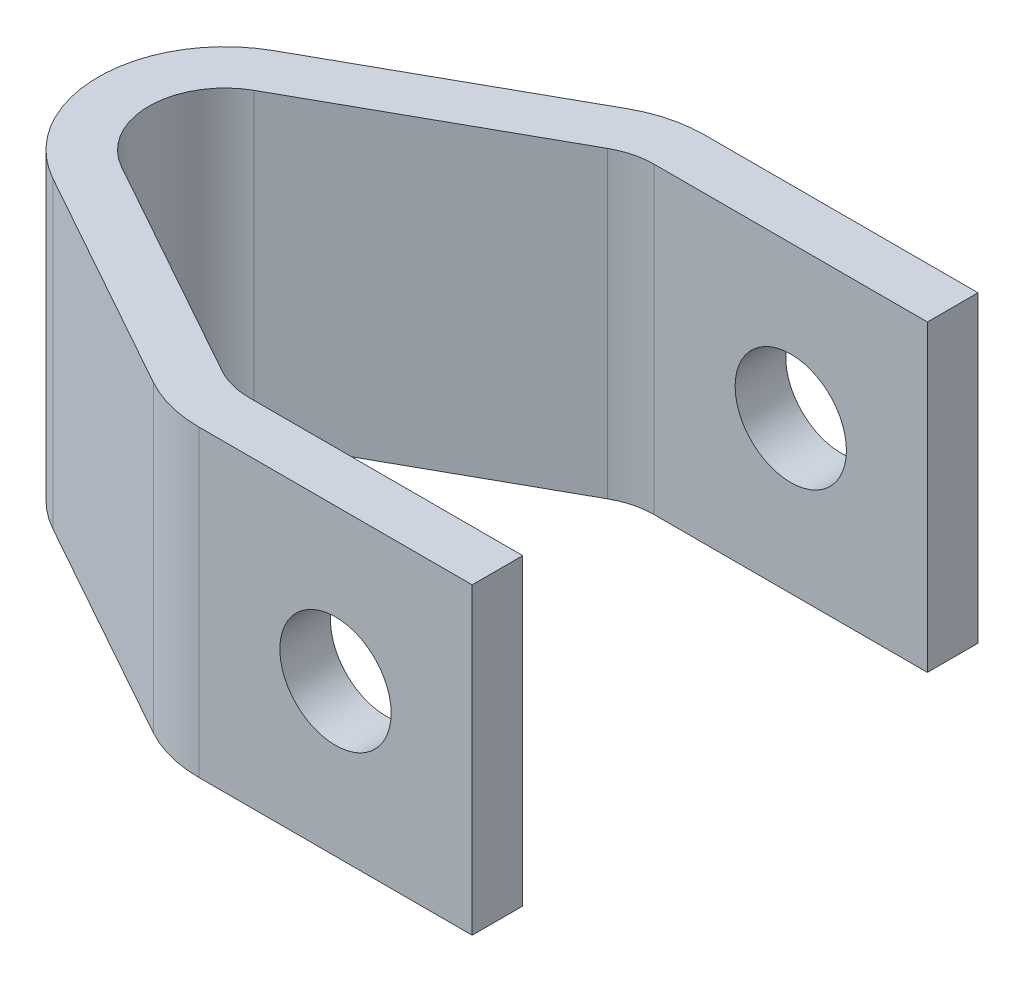
ISO-10303-21;
HEADER;
FILE_DESCRIPTION(('STEP AP214'),'2;1');
FILE_NAME('part.step','',(''),(''),'','','');
FILE_SCHEMA(('AUTOMOTIVE_DESIGN { 1 0 10303 214 1 1 1 1 }'));
ENDSEC;
DATA;
#1=APPLICATION_CONTEXT('core data for automotive mechanical design processes');
#2=APPLICATION_PROTOCOL_DEFINITION('international standard','automotive_design',2000,#1);
#3=PRODUCT_CONTEXT('',#1,'mechanical');
#4=PRODUCT('Part','Part','',(#3));
#5=PRODUCT_RELATED_PRODUCT_CATEGORY('part','',(#4));
#6=PRODUCT_DEFINITION_FORMATION('','',#4);
#7=PRODUCT_DEFINITION_CONTEXT('part definition',#1,'design');
#8=PRODUCT_DEFINITION('design','',#6,#7);
#9=PRODUCT_DEFINITION_SHAPE('','',#8);
#10=(LENGTH_UNIT() NAMED_UNIT(*) SI_UNIT(.MILLI.,.METRE.));
#11=(NAMED_UNIT(*) PLANE_ANGLE_UNIT() SI_UNIT($,.RADIAN.));
#12=(NAMED_UNIT(*) SI_UNIT($,.STERADIAN.) SOLID_ANGLE_UNIT());
#13=UNCERTAINTY_MEASURE_WITH_UNIT(LENGTH_MEASURE(1.E-05),#10,'distance_accuracy_value','');
#14=(GEOMETRIC_REPRESENTATION_CONTEXT(3) GLOBAL_UNCERTAINTY_ASSIGNED_CONTEXT((#13)) GLOBAL_UNIT_ASSIGNED_CONTEXT((#10,
#11,#12)) REPRESENTATION_CONTEXT('',''));
#15=CARTESIAN_POINT('',(0.,0.,0.));
#16=DIRECTION('',(0.,0.,1.));
#17=DIRECTION('',(1.,0.,0.));
#18=AXIS2_PLACEMENT_3D('',#15,#16,#17);
#19=CARTESIAN_POINT('',(0.154035645733331,-6.,20.));
#20=DIRECTION('',(0.,0.,-1.));
#21=DIRECTION('',(-1.,0.,0.));
#22=AXIS2_PLACEMENT_3D('',#19,#20,#21);
#23=PLANE('',#22);
#24=DIRECTION('',(-1.,0.,0.));
#25=VECTOR('',#24,1.);
#26=CARTESIAN_POINT('',(0.154035645733331,6.,20.));
#27=LINE('',#26,#25);
#28=CARTESIAN_POINT('',(12.,6.,20.));
#29=VERTEX_POINT('',#28);
#30=CARTESIAN_POINT('',(1.19311653741953,6.,20.));
#31=VERTEX_POINT('',#30);
#32=EDGE_CURVE('E162',#29,#31,#27,.T.);
#33=ORIENTED_EDGE('',*,*,#32,.T.);
#34=DIRECTION('',(0.,1.,0.));
#35=VECTOR('',#34,1.);
#36=CARTESIAN_POINT('',(1.19311653741953,-6.,20.));
#37=LINE('',#36,#35);
#38=CARTESIAN_POINT('',(1.19311653741953,-6.,20.));
#39=VERTEX_POINT('',#38);
#40=EDGE_CURVE('E24',#39,#31,#37,.T.);
#41=ORIENTED_EDGE('',*,*,#40,.F.);
#42=DIRECTION('',(-1.,0.,0.));
#43=VECTOR('',#42,1.);
#44=CARTESIAN_POINT('',(0.154035645733331,-6.,20.));
#45=LINE('',#44,#43);
#46=CARTESIAN_POINT('',(12.,-6.,20.));
#47=VERTEX_POINT('',#46);
#48=EDGE_CURVE('E99',#47,#39,#45,.T.);
#49=ORIENTED_EDGE('',*,*,#48,.F.);
#50=DIRECTION('',(0.,1.,0.));
#51=VECTOR('',#50,1.);
#52=CARTESIAN_POINT('',(12.,-6.,20.));
#53=LINE('',#52,#51);
#54=EDGE_CURVE('E10',#47,#29,#53,.T.);
#55=ORIENTED_EDGE('',*,*,#54,.T.);
#56=EDGE_LOOP('',(#33,#41,#49,#55));
#57=FACE_BOUND('',#56,.T.);
#58=CARTESIAN_POINT('',(6.59655826870976,0.,20.));
#59=DIRECTION('',(0.,0.,-1.));
#60=DIRECTION('',(1.,0.,0.));
#61=AXIS2_PLACEMENT_3D('',#58,#59,#60);
#62=CIRCLE('',#61,2.2);
#63=CARTESIAN_POINT('',(8.79655826870976,0.,20.));
#64=VERTEX_POINT('',#63);
#65=EDGE_CURVE('E305',#64,#64,#62,.T.);
#66=ORIENTED_EDGE('',*,*,#65,.T.);
#67=EDGE_LOOP('',(#66));
#68=FACE_BOUND('',#67,.T.);
#69=ADVANCED_FACE('F15',(#57,#68),#23,.F.);
#70=CARTESIAN_POINT('',(12.,-6.,0.));
#71=DIRECTION('',(0.,0.,1.));
#72=DIRECTION('',(1.,0.,0.));
#73=AXIS2_PLACEMENT_3D('',#70,#71,#72);
#74=PLANE('',#73);
#75=DIRECTION('',(1.,0.,0.));
#76=VECTOR('',#75,1.);
#77=CARTESIAN_POINT('',(12.,6.,0.));
#78=LINE('',#77,#76);
#79=CARTESIAN_POINT('',(1.19311650869849,6.,0.));
#80=VERTEX_POINT('',#79);
#81=CARTESIAN_POINT('',(12.,6.,0.));
#82=VERTEX_POINT('',#81);
#83=EDGE_CURVE('E181',#80,#82,#78,.T.);
#84=ORIENTED_EDGE('',*,*,#83,.T.);
#85=DIRECTION('',(0.,1.,0.));
#86=VECTOR('',#85,1.);
#87=CARTESIAN_POINT('',(12.,-6.,0.));
#88=LINE('',#87,#86);
#89=CARTESIAN_POINT('',(12.,-6.,0.));
#90=VERTEX_POINT('',#89);
#91=EDGE_CURVE('E224',#90,#82,#88,.T.);
#92=ORIENTED_EDGE('',*,*,#91,.F.);
#93=DIRECTION('',(1.,0.,0.));
#94=VECTOR('',#93,1.);
#95=CARTESIAN_POINT('',(12.,-6.,0.));
#96=LINE('',#95,#94);
#97=CARTESIAN_POINT('',(1.19311650869849,-6.,0.));
#98=VERTEX_POINT('',#97);
#99=EDGE_CURVE('E273',#98,#90,#96,.T.);
#100=ORIENTED_EDGE('',*,*,#99,.F.);
#101=DIRECTION('',(0.,1.,0.));
#102=VECTOR('',#101,1.);
#103=CARTESIAN_POINT('',(1.19311650869849,-6.,0.));
#104=LINE('',#103,#102);
#105=EDGE_CURVE('E227',#98,#80,#104,.T.);
#106=ORIENTED_EDGE('',*,*,#105,.T.);
#107=EDGE_LOOP('',(#84,#92,#100,#106));
#108=FACE_BOUND('',#107,.T.);
#109=CARTESIAN_POINT('',(6.59655826870976,0.,0.));
#110=DIRECTION('',(0.,0.,1.));
#111=DIRECTION('',(1.,0.,0.));
#112=AXIS2_PLACEMENT_3D('',#109,#110,#111);
#113=CIRCLE('',#112,2.2);
#114=CARTESIAN_POINT('',(8.79655826870976,0.,0.));
#115=VERTEX_POINT('',#114);
#116=EDGE_CURVE('E208',#115,#115,#113,.F.);
#117=ORIENTED_EDGE('',*,*,#116,.F.);
#118=EDGE_LOOP('',(#117));
#119=FACE_BOUND('',#118,.T.);
#120=ADVANCED_FACE('F320',(#108,#119),#74,.F.);
#121=CARTESIAN_POINT('',(12.,-6.,2.));
#122=DIRECTION('',(0.,0.,-1.));
#123=DIRECTION('',(-1.,0.,0.));
#124=AXIS2_PLACEMENT_3D('',#121,#122,#123);
#125=PLANE('',#124);
#126=DIRECTION('',(-1.,0.,0.));
#127=VECTOR('',#126,1.);
#128=CARTESIAN_POINT('',(12.,6.,2.));
#129=LINE('',#128,#127);
#130=CARTESIAN_POINT('',(12.,6.,2.));
#131=VERTEX_POINT('',#130);
#132=CARTESIAN_POINT('',(1.1931165086985,6.,2.));
#133=VERTEX_POINT('',#132);
#134=EDGE_CURVE('E187',#131,#133,#129,.T.);
#135=ORIENTED_EDGE('',*,*,#134,.T.);
#136=DIRECTION('',(0.,1.,0.));
#137=VECTOR('',#136,1.);
#138=CARTESIAN_POINT('',(1.1931165086985,-6.,2.));
#139=LINE('',#138,#137);
#140=CARTESIAN_POINT('',(1.1931165086985,-6.,2.));
#141=VERTEX_POINT('',#140);
#142=EDGE_CURVE('E218',#141,#133,#139,.T.);
#143=ORIENTED_EDGE('',*,*,#142,.F.);
#144=DIRECTION('',(-1.,0.,0.));
#145=VECTOR('',#144,1.);
#146=CARTESIAN_POINT('',(12.,-6.,2.));
#147=LINE('',#146,#145);
#148=CARTESIAN_POINT('',(12.,-6.,2.));
#149=VERTEX_POINT('',#148);
#150=EDGE_CURVE('E277',#149,#141,#147,.T.);
#151=ORIENTED_EDGE('',*,*,#150,.F.);
#152=DIRECTION('',(0.,1.,0.));
#153=VECTOR('',#152,1.);
#154=CARTESIAN_POINT('',(12.,-6.,2.));
#155=LINE('',#154,#153);
#156=EDGE_CURVE('E221',#149,#131,#155,.T.);
#157=ORIENTED_EDGE('',*,*,#156,.T.);
#158=EDGE_LOOP('',(#135,#143,#151,#157));
#159=FACE_BOUND('',#158,.T.);
#160=CARTESIAN_POINT('',(6.59655826870976,0.,2.));
#161=DIRECTION('',(0.,0.,-1.));
#162=DIRECTION('',(-1.,0.,0.));
#163=AXIS2_PLACEMENT_3D('',#160,#161,#162);
#164=CIRCLE('',#163,2.2);
#165=CARTESIAN_POINT('',(4.39655826870976,0.,2.));
#166=VERTEX_POINT('',#165);
#167=EDGE_CURVE('E304',#166,#166,#164,.F.);
#168=ORIENTED_EDGE('',*,*,#167,.F.);
#169=EDGE_LOOP('',(#168));
#170=FACE_BOUND('',#169,.T.);
#171=ADVANCED_FACE('F298',(#159,#170),#125,.F.);
#172=CARTESIAN_POINT('',(0.154035645733331,-6.,18.));
#173=DIRECTION('',(0.,0.,1.));
#174=DIRECTION('',(1.,0.,0.));
#175=AXIS2_PLACEMENT_3D('',#172,#173,#174);
#176=PLANE('',#175);
#177=DIRECTION('',(1.,0.,0.));
#178=VECTOR('',#177,1.);
#179=CARTESIAN_POINT('',(0.154035645733331,6.,18.));
#180=LINE('',#179,#178);
#181=CARTESIAN_POINT('',(1.19311653741953,6.,18.));
#182=VERTEX_POINT('',#181);
#183=CARTESIAN_POINT('',(12.,6.,18.));
#184=VERTEX_POINT('',#183);
#185=EDGE_CURVE('E91',#182,#184,#180,.T.);
#186=ORIENTED_EDGE('',*,*,#185,.T.);
#187=DIRECTION('',(0.,1.,0.));
#188=VECTOR('',#187,1.);
#189=CARTESIAN_POINT('',(12.,-6.,18.));
#190=LINE('',#189,#188);
#191=CARTESIAN_POINT('',(12.,-6.,18.));
#192=VERTEX_POINT('',#191);
#193=EDGE_CURVE('E156',#192,#184,#190,.T.);
#194=ORIENTED_EDGE('',*,*,#193,.F.);
#195=DIRECTION('',(1.,0.,0.));
#196=VECTOR('',#195,1.);
#197=CARTESIAN_POINT('',(0.154035645733331,-6.,18.));
#198=LINE('',#197,#196);
#199=CARTESIAN_POINT('',(1.19311653741953,-6.,18.));
#200=VERTEX_POINT('',#199);
#201=EDGE_CURVE('E32',#200,#192,#198,.T.);
#202=ORIENTED_EDGE('',*,*,#201,.F.);
#203=DIRECTION('',(0.,1.,0.));
#204=VECTOR('',#203,1.);
#205=CARTESIAN_POINT('',(1.19311653741953,-6.,18.));
#206=LINE('',#205,#204);
#207=EDGE_CURVE('E152',#200,#182,#206,.T.);
#208=ORIENTED_EDGE('',*,*,#207,.T.);
#209=EDGE_LOOP('',(#186,#194,#202,#208));
#210=FACE_BOUND('',#209,.T.);
#211=CARTESIAN_POINT('',(6.59655826870976,0.,18.));
#212=DIRECTION('',(0.,0.,1.));
#213=DIRECTION('',(1.,0.,0.));
#214=AXIS2_PLACEMENT_3D('',#211,#212,#213);
#215=CIRCLE('',#214,2.2);
#216=CARTESIAN_POINT('',(8.79655826870976,0.,18.));
#217=VERTEX_POINT('',#216);
#218=EDGE_CURVE('E302',#217,#217,#215,.F.);
#219=ORIENTED_EDGE('',*,*,#218,.F.);
#220=EDGE_LOOP('',(#219));
#221=FACE_BOUND('',#220,.T.);
#222=ADVANCED_FACE('F295',(#210,#221),#176,.F.);
#223=CARTESIAN_POINT('',(12.,-6.,20.));
#224=DIRECTION('',(-1.,0.,0.));
#225=DIRECTION('',(0.,0.,1.));
#226=AXIS2_PLACEMENT_3D('',#223,#224,#225);
#227=PLANE('',#226);
#228=DIRECTION('',(0.,0.,1.));
#229=VECTOR('',#228,1.);
#230=CARTESIAN_POINT('',(12.,6.,20.));
#231=LINE('',#230,#229);
#232=EDGE_CURVE('E166',#184,#29,#231,.T.);
#233=ORIENTED_EDGE('',*,*,#232,.T.);
#234=ORIENTED_EDGE('',*,*,#54,.F.);
#235=DIRECTION('',(0.,0.,1.));
#236=VECTOR('',#235,1.);
#237=CARTESIAN_POINT('',(12.,-6.,20.));
#238=LINE('',#237,#236);
#239=EDGE_CURVE('E160',#192,#47,#238,.T.);
#240=ORIENTED_EDGE('',*,*,#239,.F.);
#241=ORIENTED_EDGE('',*,*,#193,.T.);
#242=EDGE_LOOP('',(#233,#234,#240,#241));
#243=FACE_BOUND('',#242,.T.);
#244=ADVANCED_FACE('F17',(#243),#227,.F.);
#245=CARTESIAN_POINT('',(1.19311653741953,-6.,15.));
#246=DIRECTION('',(0.,1.,0.));
#247=DIRECTION('',(0.,0.,1.));
#248=AXIS2_PLACEMENT_3D('',#245,#246,#247);
#249=CYLINDRICAL_SURFACE('',#248,5.);
#250=CARTESIAN_POINT('',(1.19311653741953,6.,15.));
#251=DIRECTION('',(0.,-1.,0.));
#252=DIRECTION('',(1.,0.,0.));
#253=AXIS2_PLACEMENT_3D('',#250,#251,#252);
#254=CIRCLE('',#253,5.);
#255=CARTESIAN_POINT('',(-1.24037246963412,6.,19.3678520181605));
#256=VERTEX_POINT('',#255);
#257=EDGE_CURVE('E165',#31,#256,#254,.T.);
#258=ORIENTED_EDGE('',*,*,#257,.T.);
#259=DIRECTION('',(0.,1.,0.));
#260=VECTOR('',#259,1.);
#261=CARTESIAN_POINT('',(-1.24037246963412,-6.,19.3678520181605));
#262=LINE('',#261,#260);
#263=CARTESIAN_POINT('',(-1.24037246963412,-6.,19.3678520181605));
#264=VERTEX_POINT('',#263);
#265=EDGE_CURVE('E239',#264,#256,#262,.T.);
#266=ORIENTED_EDGE('',*,*,#265,.F.);
#267=CARTESIAN_POINT('',(1.19311653741953,-6.,15.));
#268=DIRECTION('',(0.,-1.,0.));
#269=DIRECTION('',(1.,0.,0.));
#270=AXIS2_PLACEMENT_3D('',#267,#268,#269);
#271=CIRCLE('',#270,5.);
#272=EDGE_CURVE('E247',#39,#264,#271,.T.);
#273=ORIENTED_EDGE('',*,*,#272,.F.);
#274=ORIENTED_EDGE('',*,*,#40,.T.);
#275=EDGE_LOOP('',(#258,#266,#273,#274));
#276=FACE_BOUND('',#275,.T.);
#277=ADVANCED_FACE('F245',(#276),#249,.T.);
#278=CARTESIAN_POINT('',(-16.4866978014107,-6.,10.8735704036321));
#279=DIRECTION('',(0.486697801410729,0.,-0.873570403632107));
#280=DIRECTION('',(-0.873570403632107,0.,-0.486697801410729));
#281=AXIS2_PLACEMENT_3D('',#278,#279,#280);
#282=PLANE('',#281);
#283=DIRECTION('',(-0.873570403632107,0.,-0.486697801410729));
#284=VECTOR('',#283,1.);
#285=CARTESIAN_POINT('',(-16.4866978014107,6.,10.8735704036321));
#286=LINE('',#285,#284);
#287=CARTESIAN_POINT('',(-10.2148367231712,6.,14.3678520148693));
#288=VERTEX_POINT('',#287);
#289=EDGE_CURVE('E169',#256,#288,#286,.T.);
#290=ORIENTED_EDGE('',*,*,#289,.T.);
#291=DIRECTION('',(0.,1.,0.));
#292=VECTOR('',#291,1.);
#293=CARTESIAN_POINT('',(-10.2148367231712,-6.,14.3678520148693));
#294=LINE('',#293,#292);
#295=CARTESIAN_POINT('',(-10.2148367231712,-6.,14.3678520148693));
#296=VERTEX_POINT('',#295);
#297=EDGE_CURVE('E236',#296,#288,#294,.T.);
#298=ORIENTED_EDGE('',*,*,#297,.F.);
#299=DIRECTION('',(-0.873570403632107,0.,-0.486697801410729));
#300=VECTOR('',#299,1.);
#301=CARTESIAN_POINT('',(-16.4866978014107,-6.,10.8735704036321));
#302=LINE('',#301,#300);
#303=EDGE_CURVE('E265',#264,#296,#302,.T.);
#304=ORIENTED_EDGE('',*,*,#303,.F.);
#305=ORIENTED_EDGE('',*,*,#265,.T.);
#306=EDGE_LOOP('',(#290,#298,#304,#305));
#307=FACE_BOUND('',#306,.T.);
#308=ADVANCED_FACE('F256',(#307),#282,.F.);
#309=CARTESIAN_POINT('',(-7.78134771611758,-6.,9.99999999670874));
#310=DIRECTION('',(0.,1.,0.));
#311=DIRECTION('',(0.,0.,1.));
#312=AXIS2_PLACEMENT_3D('',#309,#310,#311);
#313=CYLINDRICAL_SURFACE('',#312,5.);
#314=CARTESIAN_POINT('',(-7.78134771611758,6.,9.99999999670874));
#315=DIRECTION('',(0.,-1.,0.));
#316=DIRECTION('',(1.,0.,0.));
#317=AXIS2_PLACEMENT_3D('',#314,#315,#316);
#318=CIRCLE('',#317,5.);
#319=CARTESIAN_POINT('',(-10.2148367266696,6.,5.63214798049725));
#320=VERTEX_POINT('',#319);
#321=EDGE_CURVE('E172',#288,#320,#318,.T.);
#322=ORIENTED_EDGE('',*,*,#321,.T.);
#323=DIRECTION('',(0.,1.,0.));
#324=VECTOR('',#323,1.);
#325=CARTESIAN_POINT('',(-10.2148367266696,-6.,5.63214798049725));
#326=LINE('',#325,#324);
#327=CARTESIAN_POINT('',(-10.2148367266696,-6.,5.63214798049725));
#328=VERTEX_POINT('',#327);
#329=EDGE_CURVE('E233',#328,#320,#326,.T.);
#330=ORIENTED_EDGE('',*,*,#329,.F.);
#331=CARTESIAN_POINT('',(-7.78134771611758,-6.,9.99999999670874));
#332=DIRECTION('',(0.,-1.,0.));
#333=DIRECTION('',(1.,0.,0.));
#334=AXIS2_PLACEMENT_3D('',#331,#332,#333);
#335=CIRCLE('',#334,5.);
#336=EDGE_CURVE('E262',#296,#328,#335,.T.);
#337=ORIENTED_EDGE('',*,*,#336,.F.);
#338=ORIENTED_EDGE('',*,*,#297,.T.);
#339=EDGE_LOOP('',(#322,#330,#337,#338));
#340=FACE_BOUND('',#339,.T.);
#341=ADVANCED_FACE('F260',(#340),#313,.T.);
#342=CARTESIAN_POINT('',(-0.332662186808039,-6.,0.126429596757702));
#343=DIRECTION('',(0.486697802110394,0.,0.873570403242299));
#344=DIRECTION('',(0.873570403242299,0.,-0.486697802110394));
#345=AXIS2_PLACEMENT_3D('',#342,#343,#344);
#346=PLANE('',#345);
#347=DIRECTION('',(0.873570403242299,0.,-0.486697802110394));
#348=VECTOR('',#347,1.);
#349=CARTESIAN_POINT('',(-0.332662186808039,6.,0.126429596757702));
#350=LINE('',#349,#348);
#351=CARTESIAN_POINT('',(-1.24037250185348,6.,0.632147983788511));
#352=VERTEX_POINT('',#351);
#353=EDGE_CURVE('E175',#320,#352,#350,.T.);
#354=ORIENTED_EDGE('',*,*,#353,.T.);
#355=DIRECTION('',(0.,1.,0.));
#356=VECTOR('',#355,1.);
#357=CARTESIAN_POINT('',(-1.24037250185348,-6.,0.632147983788511));
#358=LINE('',#357,#356);
#359=CARTESIAN_POINT('',(-1.24037250185348,-6.,0.632147983788511));
#360=VERTEX_POINT('',#359);
#361=EDGE_CURVE('E230',#360,#352,#358,.T.);
#362=ORIENTED_EDGE('',*,*,#361,.F.);
#363=DIRECTION('',(0.873570403242299,0.,-0.486697802110394));
#364=VECTOR('',#363,1.);
#365=CARTESIAN_POINT('',(-0.332662186808039,-6.,0.126429596757702));
#366=LINE('',#365,#364);
#367=EDGE_CURVE('E264',#328,#360,#366,.T.);
#368=ORIENTED_EDGE('',*,*,#367,.F.);
#369=ORIENTED_EDGE('',*,*,#329,.T.);
#370=EDGE_LOOP('',(#354,#362,#368,#369));
#371=FACE_BOUND('',#370,.T.);
#372=ADVANCED_FACE('F337',(#371),#346,.F.);
#373=CARTESIAN_POINT('',(1.19311650869849,-6.,5.));
#374=DIRECTION('',(0.,1.,0.));
#375=DIRECTION('',(0.,0.,1.));
#376=AXIS2_PLACEMENT_3D('',#373,#374,#375);
#377=CYLINDRICAL_SURFACE('',#376,5.);
#378=CARTESIAN_POINT('',(1.19311650869849,6.,5.));
#379=DIRECTION('',(0.,-1.,0.));
#380=DIRECTION('',(1.,0.,0.));
#381=AXIS2_PLACEMENT_3D('',#378,#379,#380);
#382=CIRCLE('',#381,5.);
#383=EDGE_CURVE('E178',#352,#80,#382,.T.);
#384=ORIENTED_EDGE('',*,*,#383,.T.);
#385=ORIENTED_EDGE('',*,*,#105,.F.);
#386=CARTESIAN_POINT('',(1.19311650869849,-6.,5.));
#387=DIRECTION('',(0.,-1.,0.));
#388=DIRECTION('',(1.,0.,0.));
#389=AXIS2_PLACEMENT_3D('',#386,#387,#388);
#390=CIRCLE('',#389,5.);
#391=EDGE_CURVE('E267',#360,#98,#390,.T.);
#392=ORIENTED_EDGE('',*,*,#391,.F.);
#393=ORIENTED_EDGE('',*,*,#361,.T.);
#394=EDGE_LOOP('',(#384,#385,#392,#393));
#395=FACE_BOUND('',#394,.T.);
#396=ADVANCED_FACE('F334',(#395),#377,.T.);
#397=CARTESIAN_POINT('',(12.,-6.,2.));
#398=DIRECTION('',(-1.,0.,0.));
#399=DIRECTION('',(0.,0.,1.));
#400=AXIS2_PLACEMENT_3D('',#397,#398,#399);
#401=PLANE('',#400);
#402=DIRECTION('',(0.,0.,1.));
#403=VECTOR('',#402,1.);
#404=CARTESIAN_POINT('',(12.,6.,2.));
#405=LINE('',#404,#403);
#406=EDGE_CURVE('E184',#82,#131,#405,.T.);
#407=ORIENTED_EDGE('',*,*,#406,.T.);
#408=ORIENTED_EDGE('',*,*,#156,.F.);
#409=DIRECTION('',(0.,0.,1.));
#410=VECTOR('',#409,1.);
#411=CARTESIAN_POINT('',(12.,-6.,2.));
#412=LINE('',#411,#410);
#413=EDGE_CURVE('E275',#90,#149,#412,.T.);
#414=ORIENTED_EDGE('',*,*,#413,.F.);
#415=ORIENTED_EDGE('',*,*,#91,.T.);
#416=EDGE_LOOP('',(#407,#408,#414,#415));
#417=FACE_BOUND('',#416,.T.);
#418=ADVANCED_FACE('F333',(#417),#401,.F.);
#419=CARTESIAN_POINT('',(1.1931165086985,-6.,5.));
#420=DIRECTION('',(0.,1.,0.));
#421=DIRECTION('',(0.,0.,1.));
#422=AXIS2_PLACEMENT_3D('',#419,#420,#421);
#423=CYLINDRICAL_SURFACE('',#422,3.);
#424=CARTESIAN_POINT('',(1.1931165086985,6.,5.));
#425=DIRECTION('',(0.,1.,0.));
#426=DIRECTION('',(1.,0.,0.));
#427=AXIS2_PLACEMENT_3D('',#424,#425,#426);
#428=CIRCLE('',#427,3.);
#429=CARTESIAN_POINT('',(-0.266976897632688,6.,2.37928879027311));
#430=VERTEX_POINT('',#429);
#431=EDGE_CURVE('E190',#133,#430,#428,.T.);
#432=ORIENTED_EDGE('',*,*,#431,.T.);
#433=DIRECTION('',(0.,1.,0.));
#434=VECTOR('',#433,1.);
#435=CARTESIAN_POINT('',(-0.266976897632688,-6.,2.37928879027311));
#436=LINE('',#435,#434);
#437=CARTESIAN_POINT('',(-0.266976897632688,-6.,2.37928879027311));
#438=VERTEX_POINT('',#437);
#439=EDGE_CURVE('E215',#438,#430,#436,.T.);
#440=ORIENTED_EDGE('',*,*,#439,.F.);
#441=CARTESIAN_POINT('',(1.1931165086985,-6.,5.));
#442=DIRECTION('',(0.,1.,0.));
#443=DIRECTION('',(1.,0.,0.));
#444=AXIS2_PLACEMENT_3D('',#441,#442,#443);
#445=CIRCLE('',#444,3.);
#446=EDGE_CURVE('E279',#141,#438,#445,.T.);
#447=ORIENTED_EDGE('',*,*,#446,.F.);
#448=ORIENTED_EDGE('',*,*,#142,.T.);
#449=EDGE_LOOP('',(#432,#440,#447,#448));
#450=FACE_BOUND('',#449,.T.);
#451=ADVANCED_FACE('F442',(#450),#423,.F.);
#452=CARTESIAN_POINT('',(0.640733417412748,-6.,1.8735704032423));
#453=DIRECTION('',(-0.486697802110394,0.,-0.873570403242299));
#454=DIRECTION('',(-0.873570403242299,0.,0.486697802110394));
#455=AXIS2_PLACEMENT_3D('',#452,#453,#454);
#456=PLANE('',#455);
#457=DIRECTION('',(-0.873570403242299,0.,0.486697802110394));
#458=VECTOR('',#457,1.);
#459=CARTESIAN_POINT('',(0.640733417412748,6.,1.8735704032423));
#460=LINE('',#459,#458);
#461=CARTESIAN_POINT('',(-9.24144112244876,6.,7.37928878698184));
#462=VERTEX_POINT('',#461);
#463=EDGE_CURVE('E193',#430,#462,#460,.T.);
#464=ORIENTED_EDGE('',*,*,#463,.T.);
#465=DIRECTION('',(0.,1.,0.));
#466=VECTOR('',#465,1.);
#467=CARTESIAN_POINT('',(-9.24144112244876,-6.,7.37928878698184));
#468=LINE('',#467,#466);
#469=CARTESIAN_POINT('',(-9.24144112244876,-6.,7.37928878698184));
#470=VERTEX_POINT('',#469);
#471=EDGE_CURVE('E212',#470,#462,#468,.T.);
#472=ORIENTED_EDGE('',*,*,#471,.F.);
#473=DIRECTION('',(-0.873570403242299,0.,0.486697802110394));
#474=VECTOR('',#473,1.);
#475=CARTESIAN_POINT('',(0.640733417412748,-6.,1.8735704032423));
#476=LINE('',#475,#474);
#477=EDGE_CURVE('E281',#438,#470,#476,.T.);
#478=ORIENTED_EDGE('',*,*,#477,.F.);
#479=ORIENTED_EDGE('',*,*,#439,.T.);
#480=EDGE_LOOP('',(#464,#472,#478,#479));
#481=FACE_BOUND('',#480,.T.);
#482=ADVANCED_FACE('F287',(#481),#456,.F.);
#483=CARTESIAN_POINT('',(-7.78134771611758,-6.,9.99999999670874));
#484=DIRECTION('',(0.,1.,0.));
#485=DIRECTION('',(0.,0.,1.));
#486=AXIS2_PLACEMENT_3D('',#483,#484,#485);
#487=CYLINDRICAL_SURFACE('',#486,3.);
#488=CARTESIAN_POINT('',(-7.78134771611758,6.,9.99999999670874));
#489=DIRECTION('',(0.,1.,0.));
#490=DIRECTION('',(1.,0.,0.));
#491=AXIS2_PLACEMENT_3D('',#488,#489,#490);
#492=CIRCLE('',#491,3.);
#493=CARTESIAN_POINT('',(-9.24144112034976,6.,12.6207112076051));
#494=VERTEX_POINT('',#493);
#495=EDGE_CURVE('E196',#462,#494,#492,.T.);
#496=ORIENTED_EDGE('',*,*,#495,.T.);
#497=DIRECTION('',(0.,1.,0.));
#498=VECTOR('',#497,1.);
#499=CARTESIAN_POINT('',(-9.24144112034976,-6.,12.6207112076051));
#500=LINE('',#499,#498);
#501=CARTESIAN_POINT('',(-9.24144112034976,-6.,12.6207112076051));
#502=VERTEX_POINT('',#501);
#503=EDGE_CURVE('E151',#502,#494,#500,.T.);
#504=ORIENTED_EDGE('',*,*,#503,.F.);
#505=CARTESIAN_POINT('',(-7.78134771611758,-6.,9.99999999670874));
#506=DIRECTION('',(0.,1.,0.));
#507=DIRECTION('',(1.,0.,0.));
#508=AXIS2_PLACEMENT_3D('',#505,#506,#507);
#509=CIRCLE('',#508,3.);
#510=EDGE_CURVE('E142',#470,#502,#509,.T.);
#511=ORIENTED_EDGE('',*,*,#510,.F.);
#512=ORIENTED_EDGE('',*,*,#471,.T.);
#513=EDGE_LOOP('',(#496,#504,#511,#512));
#514=FACE_BOUND('',#513,.T.);
#515=ADVANCED_FACE('F291',(#514),#487,.F.);
#516=CARTESIAN_POINT('',(-15.5133021985893,-6.,9.12642959636789));
#517=DIRECTION('',(-0.486697801410729,0.,0.873570403632107));
#518=DIRECTION('',(0.873570403632107,0.,0.486697801410729));
#519=AXIS2_PLACEMENT_3D('',#516,#517,#518);
#520=PLANE('',#519);
#521=DIRECTION('',(0.873570403632107,0.,0.486697801410729));
#522=VECTOR('',#521,1.);
#523=CARTESIAN_POINT('',(-15.5133021985893,6.,9.12642959636789));
#524=LINE('',#523,#522);
#525=CARTESIAN_POINT('',(-0.266976866812655,6.,17.6207112108963));
#526=VERTEX_POINT('',#525);
#527=EDGE_CURVE('E150',#494,#526,#524,.T.);
#528=ORIENTED_EDGE('',*,*,#527,.T.);
#529=DIRECTION('',(0.,1.,0.));
#530=VECTOR('',#529,1.);
#531=CARTESIAN_POINT('',(-0.266976866812655,-6.,17.6207112108963));
#532=LINE('',#531,#530);
#533=CARTESIAN_POINT('',(-0.266976866812655,-6.,17.6207112108963));
#534=VERTEX_POINT('',#533);
#535=EDGE_CURVE('E147',#534,#526,#532,.T.);
#536=ORIENTED_EDGE('',*,*,#535,.F.);
#537=DIRECTION('',(0.873570403632107,0.,0.486697801410729));
#538=VECTOR('',#537,1.);
#539=CARTESIAN_POINT('',(-15.5133021985893,-6.,9.12642959636789));
#540=LINE('',#539,#538);
#541=EDGE_CURVE('E136',#502,#534,#540,.T.);
#542=ORIENTED_EDGE('',*,*,#541,.F.);
#543=ORIENTED_EDGE('',*,*,#503,.T.);
#544=EDGE_LOOP('',(#528,#536,#542,#543));
#545=FACE_BOUND('',#544,.T.);
#546=ADVANCED_FACE('F148',(#545),#520,.F.);
#547=CARTESIAN_POINT('',(1.19311653741953,-6.,15.));
#548=DIRECTION('',(0.,1.,0.));
#549=DIRECTION('',(0.,0.,1.));
#550=AXIS2_PLACEMENT_3D('',#547,#548,#549);
#551=CYLINDRICAL_SURFACE('',#550,3.);
#552=CARTESIAN_POINT('',(1.19311653741953,6.,15.));
#553=DIRECTION('',(0.,1.,0.));
#554=DIRECTION('',(1.,0.,0.));
#555=AXIS2_PLACEMENT_3D('',#552,#553,#554);
#556=CIRCLE('',#555,3.);
#557=EDGE_CURVE('E85',#526,#182,#556,.T.);
#558=ORIENTED_EDGE('',*,*,#557,.T.);
#559=ORIENTED_EDGE('',*,*,#207,.F.);
#560=CARTESIAN_POINT('',(1.19311653741953,-6.,15.));
#561=DIRECTION('',(0.,1.,0.));
#562=DIRECTION('',(1.,0.,0.));
#563=AXIS2_PLACEMENT_3D('',#560,#561,#562);
#564=CIRCLE('',#563,3.);
#565=EDGE_CURVE('E140',#534,#200,#564,.T.);
#566=ORIENTED_EDGE('',*,*,#565,.F.);
#567=ORIENTED_EDGE('',*,*,#535,.T.);
#568=EDGE_LOOP('',(#558,#559,#566,#567));
#569=FACE_BOUND('',#568,.T.);
#570=ADVANCED_FACE('F154',(#569),#551,.F.);
#571=CARTESIAN_POINT('',(1.19311653741953,-6.,15.));
#572=DIRECTION('',(0.,-1.,0.));
#573=DIRECTION('',(0.,0.,-1.));
#574=AXIS2_PLACEMENT_3D('',#571,#572,#573);
#575=PLANE('',#574);
#576=ORIENTED_EDGE('',*,*,#239,.T.);
#577=ORIENTED_EDGE('',*,*,#48,.T.);
#578=ORIENTED_EDGE('',*,*,#272,.T.);
#579=ORIENTED_EDGE('',*,*,#303,.T.);
#580=ORIENTED_EDGE('',*,*,#336,.T.);
#581=ORIENTED_EDGE('',*,*,#367,.T.);
#582=ORIENTED_EDGE('',*,*,#391,.T.);
#583=ORIENTED_EDGE('',*,*,#99,.T.);
#584=ORIENTED_EDGE('',*,*,#413,.T.);
#585=ORIENTED_EDGE('',*,*,#150,.T.);
#586=ORIENTED_EDGE('',*,*,#446,.T.);
#587=ORIENTED_EDGE('',*,*,#477,.T.);
#588=ORIENTED_EDGE('',*,*,#510,.T.);
#589=ORIENTED_EDGE('',*,*,#541,.T.);
#590=ORIENTED_EDGE('',*,*,#565,.T.);
#591=ORIENTED_EDGE('',*,*,#201,.T.);
#592=EDGE_LOOP('',(#576,#577,#578,#579,#580,#581,#582,#583,#584,#585,#586,#587,#588,#589,#590,#591));
#593=FACE_BOUND('',#592,.T.);
#594=ADVANCED_FACE('F138',(#593),#575,.T.);
#595=CARTESIAN_POINT('',(1.19311653741953,6.,15.));
#596=DIRECTION('',(0.,-1.,0.));
#597=DIRECTION('',(0.,0.,-1.));
#598=AXIS2_PLACEMENT_3D('',#595,#596,#597);
#599=PLANE('',#598);
#600=ORIENTED_EDGE('',*,*,#232,.F.);
#601=ORIENTED_EDGE('',*,*,#185,.F.);
#602=ORIENTED_EDGE('',*,*,#557,.F.);
#603=ORIENTED_EDGE('',*,*,#527,.F.);
#604=ORIENTED_EDGE('',*,*,#495,.F.);
#605=ORIENTED_EDGE('',*,*,#463,.F.);
#606=ORIENTED_EDGE('',*,*,#431,.F.);
#607=ORIENTED_EDGE('',*,*,#134,.F.);
#608=ORIENTED_EDGE('',*,*,#406,.F.);
#609=ORIENTED_EDGE('',*,*,#83,.F.);
#610=ORIENTED_EDGE('',*,*,#383,.F.);
#611=ORIENTED_EDGE('',*,*,#353,.F.);
#612=ORIENTED_EDGE('',*,*,#321,.F.);
#613=ORIENTED_EDGE('',*,*,#289,.F.);
#614=ORIENTED_EDGE('',*,*,#257,.F.);
#615=ORIENTED_EDGE('',*,*,#32,.F.);
#616=EDGE_LOOP('',(#600,#601,#602,#603,#604,#605,#606,#607,#608,#609,#610,#611,#612,#613,#614,#615));
#617=FACE_BOUND('',#616,.T.);
#618=ADVANCED_FACE('F251',(#617),#599,.F.);
#619=CARTESIAN_POINT('',(6.59655826870976,0.,-14.0310915873577));
#620=DIRECTION('',(0.,0.,1.));
#621=DIRECTION('',(1.,0.,0.));
#622=AXIS2_PLACEMENT_3D('',#619,#620,#621);
#623=CYLINDRICAL_SURFACE('',#622,2.2);
#624=ORIENTED_EDGE('',*,*,#218,.T.);
#625=EDGE_LOOP('',(#624));
#626=FACE_BOUND('',#625,.T.);
#627=ORIENTED_EDGE('',*,*,#65,.F.);
#628=EDGE_LOOP('',(#627));
#629=FACE_BOUND('',#628,.T.);
#630=ADVANCED_FACE('F394',(#626,#629),#623,.F.);
#631=ORIENTED_EDGE('',*,*,#116,.T.);
#632=EDGE_LOOP('',(#631));
#633=FACE_BOUND('',#632,.T.);
#634=ORIENTED_EDGE('',*,*,#167,.T.);
#635=EDGE_LOOP('',(#634));
#636=FACE_BOUND('',#635,.T.);
#637=ADVANCED_FACE('F317',(#633,#636),#623,.F.);
#638=CLOSED_SHELL('',(#69,#120,#171,#222,#244,#277,#308,#341,#372,#396,#418,#451,#482,#515,#546,
#570,#594,#618,#630,#637));
#639=MANIFOLD_SOLID_BREP('B1',#638);
#640=ADVANCED_BREP_SHAPE_REPRESENTATION('',(#18,#639),#14);
#641=SHAPE_DEFINITION_REPRESENTATION(#9,#640);
ENDSEC;
END-ISO-10303-21;
